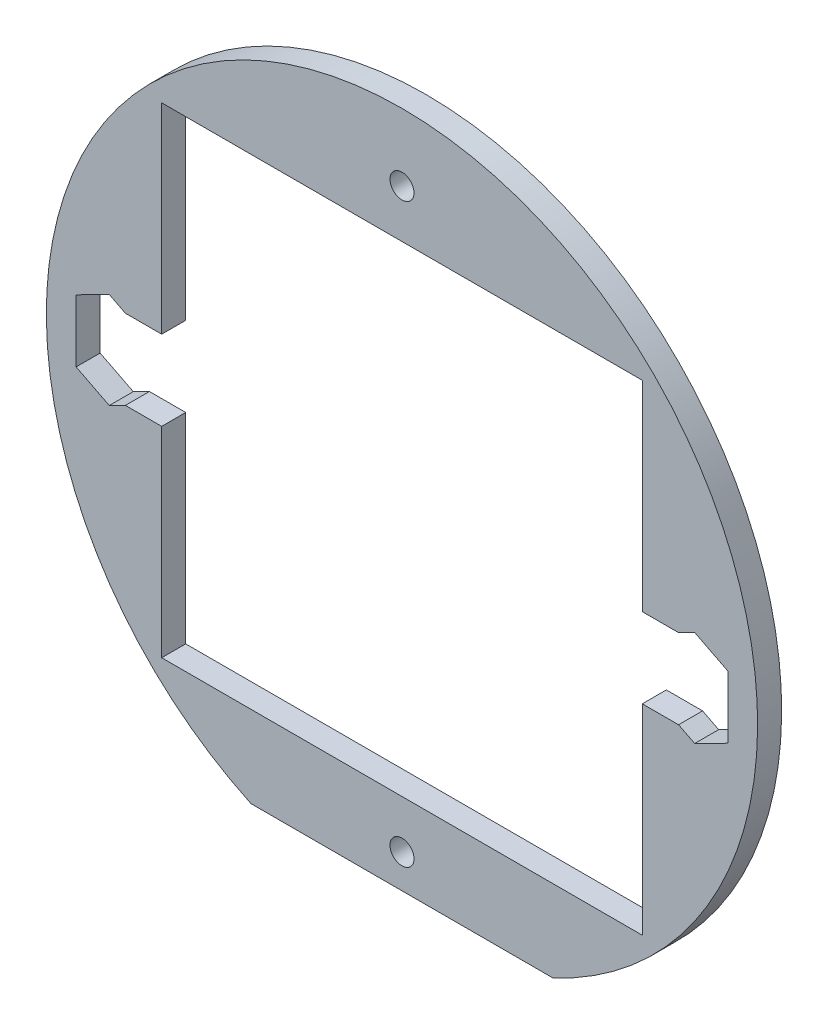
ISO-10303-21;
HEADER;
FILE_DESCRIPTION(('STEP AP214'),'2;1');
FILE_NAME('part.step','',(''),(''),'','','');
FILE_SCHEMA(('AUTOMOTIVE_DESIGN { 1 0 10303 214 1 1 1 1 }'));
ENDSEC;
DATA;
#1=APPLICATION_CONTEXT('core data for automotive mechanical design processes');
#2=APPLICATION_PROTOCOL_DEFINITION('international standard','automotive_design',2000,#1);
#3=PRODUCT_CONTEXT('',#1,'mechanical');
#4=PRODUCT('Part','Part','',(#3));
#5=PRODUCT_RELATED_PRODUCT_CATEGORY('part','',(#4));
#6=PRODUCT_DEFINITION_FORMATION('','',#4);
#7=PRODUCT_DEFINITION_CONTEXT('part definition',#1,'design');
#8=PRODUCT_DEFINITION('design','',#6,#7);
#9=PRODUCT_DEFINITION_SHAPE('','',#8);
#10=(LENGTH_UNIT() NAMED_UNIT(*) SI_UNIT(.MILLI.,.METRE.));
#11=(NAMED_UNIT(*) PLANE_ANGLE_UNIT() SI_UNIT($,.RADIAN.));
#12=(NAMED_UNIT(*) SI_UNIT($,.STERADIAN.) SOLID_ANGLE_UNIT());
#13=UNCERTAINTY_MEASURE_WITH_UNIT(LENGTH_MEASURE(1.E-05),#10,'distance_accuracy_value','');
#14=(GEOMETRIC_REPRESENTATION_CONTEXT(3) GLOBAL_UNCERTAINTY_ASSIGNED_CONTEXT((#13)) GLOBAL_UNIT_ASSIGNED_CONTEXT((#10,
#11,#12)) REPRESENTATION_CONTEXT('',''));
#15=CARTESIAN_POINT('',(0.,0.,0.));
#16=DIRECTION('',(0.,0.,1.));
#17=DIRECTION('',(1.,0.,0.));
#18=AXIS2_PLACEMENT_3D('',#15,#16,#17);
#19=CARTESIAN_POINT('',(-50.,50.,0.));
#20=DIRECTION('',(-1.,0.,0.));
#21=DIRECTION('',(0.,-1.,0.));
#22=AXIS2_PLACEMENT_3D('',#19,#20,#21);
#23=PLANE('',#22);
#24=DIRECTION('',(0.,-1.,0.));
#25=VECTOR('',#24,1.);
#26=CARTESIAN_POINT('',(-50.,50.,0.));
#27=LINE('',#26,#25);
#28=CARTESIAN_POINT('',(-50.,-8.3,0.));
#29=VERTEX_POINT('',#28);
#30=CARTESIAN_POINT('',(-50.,-50.,0.));
#31=VERTEX_POINT('',#30);
#32=EDGE_CURVE('E381',#29,#31,#27,.T.);
#33=ORIENTED_EDGE('',*,*,#32,.F.);
#34=DIRECTION('',(0.,0.,1.));
#35=VECTOR('',#34,1.);
#36=CARTESIAN_POINT('',(-50.,-8.3,0.));
#37=LINE('',#36,#35);
#38=CARTESIAN_POINT('',(-50.,-8.3,5.));
#39=VERTEX_POINT('',#38);
#40=EDGE_CURVE('E264',#29,#39,#37,.T.);
#41=ORIENTED_EDGE('',*,*,#40,.T.);
#42=DIRECTION('',(0.,-1.,0.));
#43=VECTOR('',#42,1.);
#44=CARTESIAN_POINT('',(-50.,50.,5.));
#45=LINE('',#44,#43);
#46=CARTESIAN_POINT('',(-50.,-50.,5.));
#47=VERTEX_POINT('',#46);
#48=EDGE_CURVE('E366',#39,#47,#45,.T.);
#49=ORIENTED_EDGE('',*,*,#48,.T.);
#50=DIRECTION('',(0.,0.,1.));
#51=VECTOR('',#50,1.);
#52=CARTESIAN_POINT('',(-50.,-50.,0.));
#53=LINE('',#52,#51);
#54=EDGE_CURVE('E393',#31,#47,#53,.T.);
#55=ORIENTED_EDGE('',*,*,#54,.F.);
#56=EDGE_LOOP('',(#33,#41,#49,#55));
#57=FACE_BOUND('',#56,.T.);
#58=ADVANCED_FACE('F43',(#57),#23,.F.);
#59=CARTESIAN_POINT('',(50.,50.,0.));
#60=DIRECTION('',(1.,0.,0.));
#61=DIRECTION('',(0.,1.,0.));
#62=AXIS2_PLACEMENT_3D('',#59,#60,#61);
#63=PLANE('',#62);
#64=DIRECTION('',(0.,1.,0.));
#65=VECTOR('',#64,1.);
#66=CARTESIAN_POINT('',(50.,50.,5.));
#67=LINE('',#66,#65);
#68=CARTESIAN_POINT('',(50.,-50.,5.));
#69=VERTEX_POINT('',#68);
#70=CARTESIAN_POINT('',(50.,-8.3,5.));
#71=VERTEX_POINT('',#70);
#72=EDGE_CURVE('E403',#69,#71,#67,.T.);
#73=ORIENTED_EDGE('',*,*,#72,.T.);
#74=DIRECTION('',(0.,0.,1.));
#75=VECTOR('',#74,1.);
#76=CARTESIAN_POINT('',(50.,-8.3,0.));
#77=LINE('',#76,#75);
#78=CARTESIAN_POINT('',(50.,-8.3,0.));
#79=VERTEX_POINT('',#78);
#80=EDGE_CURVE('E354',#79,#71,#77,.T.);
#81=ORIENTED_EDGE('',*,*,#80,.F.);
#82=DIRECTION('',(0.,1.,0.));
#83=VECTOR('',#82,1.);
#84=CARTESIAN_POINT('',(50.,50.,0.));
#85=LINE('',#84,#83);
#86=CARTESIAN_POINT('',(50.,-50.,0.));
#87=VERTEX_POINT('',#86);
#88=EDGE_CURVE('E386',#87,#79,#85,.T.);
#89=ORIENTED_EDGE('',*,*,#88,.F.);
#90=DIRECTION('',(0.,0.,1.));
#91=VECTOR('',#90,1.);
#92=CARTESIAN_POINT('',(50.,-50.,0.));
#93=LINE('',#92,#91);
#94=EDGE_CURVE('E419',#87,#69,#93,.T.);
#95=ORIENTED_EDGE('',*,*,#94,.T.);
#96=EDGE_LOOP('',(#73,#81,#89,#95));
#97=FACE_BOUND('',#96,.T.);
#98=ADVANCED_FACE('F462',(#97),#63,.F.);
#99=CARTESIAN_POINT('',(-31.41655614481,-67.,5.));
#100=DIRECTION('',(0.,1.,0.));
#101=DIRECTION('',(-1.,0.,0.));
#102=AXIS2_PLACEMENT_3D('',#99,#100,#101);
#103=PLANE('',#102);
#104=DIRECTION('',(1.,0.,0.));
#105=VECTOR('',#104,1.);
#106=CARTESIAN_POINT('',(-31.41655614481,-67.,0.));
#107=LINE('',#106,#105);
#108=CARTESIAN_POINT('',(-31.41655614481,-67.,0.));
#109=VERTEX_POINT('',#108);
#110=CARTESIAN_POINT('',(31.41655614481,-67.,0.));
#111=VERTEX_POINT('',#110);
#112=EDGE_CURVE('E414',#109,#111,#107,.T.);
#113=ORIENTED_EDGE('',*,*,#112,.T.);
#114=DIRECTION('',(0.,0.,-1.));
#115=VECTOR('',#114,1.);
#116=CARTESIAN_POINT('',(31.41655614481,-67.,5.));
#117=LINE('',#116,#115);
#118=CARTESIAN_POINT('',(31.41655614481,-67.,5.));
#119=VERTEX_POINT('',#118);
#120=EDGE_CURVE('E11',#119,#111,#117,.T.);
#121=ORIENTED_EDGE('',*,*,#120,.F.);
#122=DIRECTION('',(1.,0.,0.));
#123=VECTOR('',#122,1.);
#124=CARTESIAN_POINT('',(-31.41655614481,-67.,5.));
#125=LINE('',#124,#123);
#126=CARTESIAN_POINT('',(-31.41655614481,-67.,5.));
#127=VERTEX_POINT('',#126);
#128=EDGE_CURVE('E425',#127,#119,#125,.T.);
#129=ORIENTED_EDGE('',*,*,#128,.F.);
#130=DIRECTION('',(0.,0.,-1.));
#131=VECTOR('',#130,1.);
#132=CARTESIAN_POINT('',(-31.41655614481,-67.,5.));
#133=LINE('',#132,#131);
#134=EDGE_CURVE('E52',#127,#109,#133,.T.);
#135=ORIENTED_EDGE('',*,*,#134,.T.);
#136=EDGE_LOOP('',(#113,#121,#129,#135));
#137=FACE_BOUND('',#136,.T.);
#138=ADVANCED_FACE('F45',(#137),#103,.F.);
#139=CARTESIAN_POINT('',(0.,0.,5.));
#140=DIRECTION('',(0.,0.,-1.));
#141=DIRECTION('',(-1.,0.,0.));
#142=AXIS2_PLACEMENT_3D('',#139,#140,#141);
#143=CYLINDRICAL_SURFACE('',#142,74.);
#144=CARTESIAN_POINT('',(0.,0.,0.));
#145=DIRECTION('',(0.,0.,1.));
#146=DIRECTION('',(1.,0.,0.));
#147=AXIS2_PLACEMENT_3D('',#144,#145,#146);
#148=CIRCLE('',#147,74.);
#149=EDGE_CURVE('E430',#111,#109,#148,.T.);
#150=ORIENTED_EDGE('',*,*,#149,.T.);
#151=ORIENTED_EDGE('',*,*,#134,.F.);
#152=CARTESIAN_POINT('',(0.,0.,5.));
#153=DIRECTION('',(0.,0.,1.));
#154=DIRECTION('',(1.,0.,0.));
#155=AXIS2_PLACEMENT_3D('',#152,#153,#154);
#156=CIRCLE('',#155,74.);
#157=EDGE_CURVE('E429',#119,#127,#156,.T.);
#158=ORIENTED_EDGE('',*,*,#157,.F.);
#159=ORIENTED_EDGE('',*,*,#120,.T.);
#160=EDGE_LOOP('',(#150,#151,#158,#159));
#161=FACE_BOUND('',#160,.T.);
#162=ADVANCED_FACE('F445',(#161),#143,.T.);
#163=CARTESIAN_POINT('',(0.,0.,5.));
#164=DIRECTION('',(0.,0.,1.));
#165=DIRECTION('',(1.,0.,0.));
#166=AXIS2_PLACEMENT_3D('',#163,#164,#165);
#167=PLANE('',#166);
#168=DIRECTION('',(1.,0.,0.));
#169=VECTOR('',#168,1.);
#170=CARTESIAN_POINT('',(-50.,-8.3,5.));
#171=LINE('',#170,#169);
#172=CARTESIAN_POINT('',(-57.55,-8.3,5.));
#173=VERTEX_POINT('',#172);
#174=EDGE_CURVE('E220',#173,#39,#171,.T.);
#175=ORIENTED_EDGE('',*,*,#174,.F.);
#176=DIRECTION('',(0.891953238375036,0.452127659574469,0.));
#177=VECTOR('',#176,1.);
#178=CARTESIAN_POINT('',(-57.55,-8.3,5.));
#179=LINE('',#178,#177);
#180=CARTESIAN_POINT('',(-60.9037441762901,-10.,5.));
#181=VERTEX_POINT('',#180);
#182=EDGE_CURVE('E223',#181,#173,#179,.T.);
#183=ORIENTED_EDGE('',*,*,#182,.F.);
#184=DIRECTION('',(0.891918399697068,-0.452196382428941,0.));
#185=VECTOR('',#184,1.);
#186=CARTESIAN_POINT('',(-60.9037441762901,-10.,5.));
#187=LINE('',#186,#185);
#188=CARTESIAN_POINT('',(-67.8071925899454,-6.5,5.));
#189=VERTEX_POINT('',#188);
#190=EDGE_CURVE('E257',#189,#181,#187,.T.);
#191=ORIENTED_EDGE('',*,*,#190,.F.);
#192=DIRECTION('',(0.,-1.,0.));
#193=VECTOR('',#192,1.);
#194=CARTESIAN_POINT('',(-67.8071925899454,-6.5,5.));
#195=LINE('',#194,#193);
#196=CARTESIAN_POINT('',(-67.8071925899454,6.5,5.));
#197=VERTEX_POINT('',#196);
#198=EDGE_CURVE('E253',#197,#189,#195,.T.);
#199=ORIENTED_EDGE('',*,*,#198,.F.);
#200=DIRECTION('',(-0.891918399697068,-0.45219638242894,0.));
#201=VECTOR('',#200,1.);
#202=CARTESIAN_POINT('',(-67.8071925899454,6.5,5.));
#203=LINE('',#202,#201);
#204=CARTESIAN_POINT('',(-60.9037441762901,10.,5.));
#205=VERTEX_POINT('',#204);
#206=EDGE_CURVE('E249',#205,#197,#203,.T.);
#207=ORIENTED_EDGE('',*,*,#206,.F.);
#208=DIRECTION('',(-0.891953238375035,0.45212765957447,0.));
#209=VECTOR('',#208,1.);
#210=CARTESIAN_POINT('',(-60.9037441762901,10.,5.));
#211=LINE('',#210,#209);
#212=CARTESIAN_POINT('',(-57.55,8.3,5.));
#213=VERTEX_POINT('',#212);
#214=EDGE_CURVE('E245',#213,#205,#211,.T.);
#215=ORIENTED_EDGE('',*,*,#214,.F.);
#216=DIRECTION('',(-1.,0.,0.));
#217=VECTOR('',#216,1.);
#218=CARTESIAN_POINT('',(-57.55,8.3,5.));
#219=LINE('',#218,#217);
#220=CARTESIAN_POINT('',(-50.,8.3,5.));
#221=VERTEX_POINT('',#220);
#222=EDGE_CURVE('E195',#221,#213,#219,.T.);
#223=ORIENTED_EDGE('',*,*,#222,.F.);
#224=CARTESIAN_POINT('',(-50.,50.,5.));
#225=VERTEX_POINT('',#224);
#226=EDGE_CURVE('E394',#225,#221,#45,.T.);
#227=ORIENTED_EDGE('',*,*,#226,.F.);
#228=DIRECTION('',(-1.,0.,0.));
#229=VECTOR('',#228,1.);
#230=CARTESIAN_POINT('',(50.,50.,5.));
#231=LINE('',#230,#229);
#232=CARTESIAN_POINT('',(50.,50.,5.));
#233=VERTEX_POINT('',#232);
#234=EDGE_CURVE('E407',#233,#225,#231,.T.);
#235=ORIENTED_EDGE('',*,*,#234,.F.);
#236=CARTESIAN_POINT('',(50.,8.3,5.));
#237=VERTEX_POINT('',#236);
#238=EDGE_CURVE('E402',#237,#233,#67,.T.);
#239=ORIENTED_EDGE('',*,*,#238,.F.);
#240=DIRECTION('',(-1.,0.,0.));
#241=VECTOR('',#240,1.);
#242=CARTESIAN_POINT('',(57.55,8.3,5.));
#243=LINE('',#242,#241);
#244=CARTESIAN_POINT('',(57.55,8.3,5.));
#245=VERTEX_POINT('',#244);
#246=EDGE_CURVE('E67',#245,#237,#243,.T.);
#247=ORIENTED_EDGE('',*,*,#246,.F.);
#248=DIRECTION('',(-0.891953238375037,-0.452127659574467,0.));
#249=VECTOR('',#248,1.);
#250=CARTESIAN_POINT('',(60.9037441762901,9.99999999999999,5.));
#251=LINE('',#250,#249);
#252=CARTESIAN_POINT('',(60.9037441762901,9.99999999999999,5.));
#253=VERTEX_POINT('',#252);
#254=EDGE_CURVE('E315',#253,#245,#251,.T.);
#255=ORIENTED_EDGE('',*,*,#254,.F.);
#256=DIRECTION('',(-0.891918399697068,0.452196382428941,0.));
#257=VECTOR('',#256,1.);
#258=CARTESIAN_POINT('',(67.8071925899454,6.49999999999999,5.));
#259=LINE('',#258,#257);
#260=CARTESIAN_POINT('',(67.8071925899454,6.49999999999999,5.));
#261=VERTEX_POINT('',#260);
#262=EDGE_CURVE('E290',#261,#253,#259,.T.);
#263=ORIENTED_EDGE('',*,*,#262,.F.);
#264=DIRECTION('',(0.,1.,0.));
#265=VECTOR('',#264,1.);
#266=CARTESIAN_POINT('',(67.8071925899454,-6.5,5.));
#267=LINE('',#266,#265);
#268=CARTESIAN_POINT('',(67.8071925899454,-6.5,5.));
#269=VERTEX_POINT('',#268);
#270=EDGE_CURVE('E333',#269,#261,#267,.T.);
#271=ORIENTED_EDGE('',*,*,#270,.F.);
#272=DIRECTION('',(0.891918399697068,0.452196382428941,0.));
#273=VECTOR('',#272,1.);
#274=CARTESIAN_POINT('',(60.9037441762901,-10.,5.));
#275=LINE('',#274,#273);
#276=CARTESIAN_POINT('',(60.9037441762901,-10.,5.));
#277=VERTEX_POINT('',#276);
#278=EDGE_CURVE('E329',#277,#269,#275,.T.);
#279=ORIENTED_EDGE('',*,*,#278,.F.);
#280=DIRECTION('',(0.891953238375036,-0.452127659574469,0.));
#281=VECTOR('',#280,1.);
#282=CARTESIAN_POINT('',(57.55,-8.3,5.));
#283=LINE('',#282,#281);
#284=CARTESIAN_POINT('',(57.55,-8.3,5.));
#285=VERTEX_POINT('',#284);
#286=EDGE_CURVE('E325',#285,#277,#283,.T.);
#287=ORIENTED_EDGE('',*,*,#286,.F.);
#288=DIRECTION('',(1.,0.,0.));
#289=VECTOR('',#288,1.);
#290=CARTESIAN_POINT('',(50.,-8.3,5.));
#291=LINE('',#290,#289);
#292=EDGE_CURVE('E321',#71,#285,#291,.T.);
#293=ORIENTED_EDGE('',*,*,#292,.F.);
#294=ORIENTED_EDGE('',*,*,#72,.F.);
#295=DIRECTION('',(1.,0.,0.));
#296=VECTOR('',#295,1.);
#297=CARTESIAN_POINT('',(50.,-50.,5.));
#298=LINE('',#297,#296);
#299=EDGE_CURVE('E398',#47,#69,#298,.T.);
#300=ORIENTED_EDGE('',*,*,#299,.F.);
#301=ORIENTED_EDGE('',*,*,#48,.F.);
#302=EDGE_LOOP('',(#175,#183,#191,#199,#207,#215,#223,#227,#235,#239,#247,#255,#263,#271,#279,
#287,#293,#294,#300,#301));
#303=FACE_BOUND('',#302,.T.);
#304=CARTESIAN_POINT('',(0.,60.,5.));
#305=DIRECTION('',(0.,0.,1.));
#306=DIRECTION('',(1.,0.,0.));
#307=AXIS2_PLACEMENT_3D('',#304,#305,#306);
#308=CIRCLE('',#307,2.5);
#309=CARTESIAN_POINT('',(2.50000000000001,60.,5.));
#310=VERTEX_POINT('',#309);
#311=EDGE_CURVE('E367',#310,#310,#308,.T.);
#312=ORIENTED_EDGE('',*,*,#311,.F.);
#313=EDGE_LOOP('',(#312));
#314=FACE_BOUND('',#313,.T.);
#315=CARTESIAN_POINT('',(0.,-60.,5.));
#316=DIRECTION('',(0.,0.,1.));
#317=DIRECTION('',(1.,0.,0.));
#318=AXIS2_PLACEMENT_3D('',#315,#316,#317);
#319=CIRCLE('',#318,2.5);
#320=CARTESIAN_POINT('',(2.5,-60.,5.));
#321=VERTEX_POINT('',#320);
#322=EDGE_CURVE('E268',#321,#321,#319,.T.);
#323=ORIENTED_EDGE('',*,*,#322,.F.);
#324=EDGE_LOOP('',(#323));
#325=FACE_BOUND('',#324,.T.);
#326=ORIENTED_EDGE('',*,*,#128,.T.);
#327=ORIENTED_EDGE('',*,*,#157,.T.);
#328=EDGE_LOOP('',(#326,#327));
#329=FACE_BOUND('',#328,.T.);
#330=ADVANCED_FACE('F447',(#303,#314,#325,#329),#167,.T.);
#331=CARTESIAN_POINT('',(0.,0.,0.));
#332=DIRECTION('',(0.,0.,1.));
#333=DIRECTION('',(1.,0.,0.));
#334=AXIS2_PLACEMENT_3D('',#331,#332,#333);
#335=PLANE('',#334);
#336=CARTESIAN_POINT('',(0.,60.,0.));
#337=DIRECTION('',(0.,0.,1.));
#338=DIRECTION('',(1.,0.,0.));
#339=AXIS2_PLACEMENT_3D('',#336,#337,#338);
#340=CIRCLE('',#339,2.5);
#341=CARTESIAN_POINT('',(2.50000000000001,60.,0.));
#342=VERTEX_POINT('',#341);
#343=EDGE_CURVE('E362',#342,#342,#340,.T.);
#344=ORIENTED_EDGE('',*,*,#343,.T.);
#345=EDGE_LOOP('',(#344));
#346=FACE_BOUND('',#345,.T.);
#347=CARTESIAN_POINT('',(0.,-60.,0.));
#348=DIRECTION('',(0.,0.,1.));
#349=DIRECTION('',(1.,0.,0.));
#350=AXIS2_PLACEMENT_3D('',#347,#348,#349);
#351=CIRCLE('',#350,2.5);
#352=CARTESIAN_POINT('',(2.5,-60.,0.));
#353=VERTEX_POINT('',#352);
#354=EDGE_CURVE('E371',#353,#353,#351,.T.);
#355=ORIENTED_EDGE('',*,*,#354,.T.);
#356=EDGE_LOOP('',(#355));
#357=FACE_BOUND('',#356,.T.);
#358=DIRECTION('',(0.891953238375036,0.452127659574469,0.));
#359=VECTOR('',#358,1.);
#360=CARTESIAN_POINT('',(-57.55,-8.3,0.));
#361=LINE('',#360,#359);
#362=CARTESIAN_POINT('',(-60.9037441762901,-10.,0.));
#363=VERTEX_POINT('',#362);
#364=CARTESIAN_POINT('',(-57.55,-8.3,0.));
#365=VERTEX_POINT('',#364);
#366=EDGE_CURVE('E236',#363,#365,#361,.T.);
#367=ORIENTED_EDGE('',*,*,#366,.T.);
#368=DIRECTION('',(1.,0.,0.));
#369=VECTOR('',#368,1.);
#370=CARTESIAN_POINT('',(-50.,-8.3,0.));
#371=LINE('',#370,#369);
#372=EDGE_CURVE('E239',#365,#29,#371,.T.);
#373=ORIENTED_EDGE('',*,*,#372,.T.);
#374=ORIENTED_EDGE('',*,*,#32,.T.);
#375=DIRECTION('',(1.,0.,0.));
#376=VECTOR('',#375,1.);
#377=CARTESIAN_POINT('',(50.,-50.,0.));
#378=LINE('',#377,#376);
#379=EDGE_CURVE('E380',#31,#87,#378,.T.);
#380=ORIENTED_EDGE('',*,*,#379,.T.);
#381=ORIENTED_EDGE('',*,*,#88,.T.);
#382=DIRECTION('',(1.,0.,0.));
#383=VECTOR('',#382,1.);
#384=CARTESIAN_POINT('',(50.,-8.3,0.));
#385=LINE('',#384,#383);
#386=CARTESIAN_POINT('',(57.55,-8.3,0.));
#387=VERTEX_POINT('',#386);
#388=EDGE_CURVE('E294',#79,#387,#385,.T.);
#389=ORIENTED_EDGE('',*,*,#388,.T.);
#390=DIRECTION('',(0.891953238375036,-0.452127659574469,0.));
#391=VECTOR('',#390,1.);
#392=CARTESIAN_POINT('',(57.55,-8.3,0.));
#393=LINE('',#392,#391);
#394=CARTESIAN_POINT('',(60.9037441762901,-10.,0.));
#395=VERTEX_POINT('',#394);
#396=EDGE_CURVE('E298',#387,#395,#393,.T.);
#397=ORIENTED_EDGE('',*,*,#396,.T.);
#398=DIRECTION('',(0.891918399697068,0.452196382428941,0.));
#399=VECTOR('',#398,1.);
#400=CARTESIAN_POINT('',(60.9037441762901,-10.,0.));
#401=LINE('',#400,#399);
#402=CARTESIAN_POINT('',(67.8071925899454,-6.5,0.));
#403=VERTEX_POINT('',#402);
#404=EDGE_CURVE('E302',#395,#403,#401,.T.);
#405=ORIENTED_EDGE('',*,*,#404,.T.);
#406=DIRECTION('',(0.,1.,0.));
#407=VECTOR('',#406,1.);
#408=CARTESIAN_POINT('',(67.8071925899454,-6.5,0.));
#409=LINE('',#408,#407);
#410=CARTESIAN_POINT('',(67.8071925899454,6.49999999999999,0.));
#411=VERTEX_POINT('',#410);
#412=EDGE_CURVE('E306',#403,#411,#409,.T.);
#413=ORIENTED_EDGE('',*,*,#412,.T.);
#414=DIRECTION('',(-0.891918399697068,0.452196382428941,0.));
#415=VECTOR('',#414,1.);
#416=CARTESIAN_POINT('',(67.8071925899454,6.49999999999999,0.));
#417=LINE('',#416,#415);
#418=CARTESIAN_POINT('',(60.9037441762901,9.99999999999999,0.));
#419=VERTEX_POINT('',#418);
#420=EDGE_CURVE('E310',#411,#419,#417,.T.);
#421=ORIENTED_EDGE('',*,*,#420,.T.);
#422=DIRECTION('',(-0.891953238375037,-0.452127659574467,0.));
#423=VECTOR('',#422,1.);
#424=CARTESIAN_POINT('',(60.9037441762901,9.99999999999999,0.));
#425=LINE('',#424,#423);
#426=CARTESIAN_POINT('',(57.55,8.3,0.));
#427=VERTEX_POINT('',#426);
#428=EDGE_CURVE('E285',#419,#427,#425,.T.);
#429=ORIENTED_EDGE('',*,*,#428,.T.);
#430=DIRECTION('',(-1.,0.,0.));
#431=VECTOR('',#430,1.);
#432=CARTESIAN_POINT('',(57.55,8.3,0.));
#433=LINE('',#432,#431);
#434=CARTESIAN_POINT('',(50.,8.3,0.));
#435=VERTEX_POINT('',#434);
#436=EDGE_CURVE('E289',#427,#435,#433,.T.);
#437=ORIENTED_EDGE('',*,*,#436,.T.);
#438=CARTESIAN_POINT('',(50.,50.,0.));
#439=VERTEX_POINT('',#438);
#440=EDGE_CURVE('E385',#435,#439,#85,.T.);
#441=ORIENTED_EDGE('',*,*,#440,.T.);
#442=DIRECTION('',(-1.,0.,0.));
#443=VECTOR('',#442,1.);
#444=CARTESIAN_POINT('',(50.,50.,0.));
#445=LINE('',#444,#443);
#446=CARTESIAN_POINT('',(-50.,50.,0.));
#447=VERTEX_POINT('',#446);
#448=EDGE_CURVE('E390',#439,#447,#445,.T.);
#449=ORIENTED_EDGE('',*,*,#448,.T.);
#450=CARTESIAN_POINT('',(-50.,8.3,0.));
#451=VERTEX_POINT('',#450);
#452=EDGE_CURVE('E218',#447,#451,#27,.T.);
#453=ORIENTED_EDGE('',*,*,#452,.T.);
#454=DIRECTION('',(-1.,0.,0.));
#455=VECTOR('',#454,1.);
#456=CARTESIAN_POINT('',(-57.55,8.3,0.));
#457=LINE('',#456,#455);
#458=CARTESIAN_POINT('',(-57.55,8.3,0.));
#459=VERTEX_POINT('',#458);
#460=EDGE_CURVE('E59',#451,#459,#457,.T.);
#461=ORIENTED_EDGE('',*,*,#460,.T.);
#462=DIRECTION('',(-0.891953238375035,0.45212765957447,0.));
#463=VECTOR('',#462,1.);
#464=CARTESIAN_POINT('',(-60.9037441762901,10.,0.));
#465=LINE('',#464,#463);
#466=CARTESIAN_POINT('',(-60.9037441762901,10.,0.));
#467=VERTEX_POINT('',#466);
#468=EDGE_CURVE('E204',#459,#467,#465,.T.);
#469=ORIENTED_EDGE('',*,*,#468,.T.);
#470=DIRECTION('',(-0.891918399697068,-0.45219638242894,0.));
#471=VECTOR('',#470,1.);
#472=CARTESIAN_POINT('',(-67.8071925899454,6.5,0.));
#473=LINE('',#472,#471);
#474=CARTESIAN_POINT('',(-67.8071925899454,6.5,0.));
#475=VERTEX_POINT('',#474);
#476=EDGE_CURVE('E210',#467,#475,#473,.T.);
#477=ORIENTED_EDGE('',*,*,#476,.T.);
#478=DIRECTION('',(0.,-1.,0.));
#479=VECTOR('',#478,1.);
#480=CARTESIAN_POINT('',(-67.8071925899454,-6.5,0.));
#481=LINE('',#480,#479);
#482=CARTESIAN_POINT('',(-67.8071925899454,-6.5,0.));
#483=VERTEX_POINT('',#482);
#484=EDGE_CURVE('E228',#475,#483,#481,.T.);
#485=ORIENTED_EDGE('',*,*,#484,.T.);
#486=DIRECTION('',(0.891918399697068,-0.452196382428941,0.));
#487=VECTOR('',#486,1.);
#488=CARTESIAN_POINT('',(-60.9037441762901,-10.,0.));
#489=LINE('',#488,#487);
#490=EDGE_CURVE('E232',#483,#363,#489,.T.);
#491=ORIENTED_EDGE('',*,*,#490,.T.);
#492=EDGE_LOOP('',(#367,#373,#374,#380,#381,#389,#397,#405,#413,#421,#429,#437,#441,#449,#453,
#461,#469,#477,#485,#491));
#493=FACE_BOUND('',#492,.T.);
#494=ORIENTED_EDGE('',*,*,#112,.F.);
#495=ORIENTED_EDGE('',*,*,#149,.F.);
#496=EDGE_LOOP('',(#494,#495));
#497=FACE_BOUND('',#496,.T.);
#498=ADVANCED_FACE('F214',(#346,#357,#493,#497),#335,.F.);
#499=ORIENTED_EDGE('',*,*,#226,.T.);
#500=DIRECTION('',(0.,0.,1.));
#501=VECTOR('',#500,1.);
#502=CARTESIAN_POINT('',(-50.,8.3,0.));
#503=LINE('',#502,#501);
#504=EDGE_CURVE('E201',#451,#221,#503,.T.);
#505=ORIENTED_EDGE('',*,*,#504,.F.);
#506=ORIENTED_EDGE('',*,*,#452,.F.);
#507=DIRECTION('',(0.,0.,1.));
#508=VECTOR('',#507,1.);
#509=CARTESIAN_POINT('',(-50.,50.,0.));
#510=LINE('',#509,#508);
#511=EDGE_CURVE('E411',#447,#225,#510,.T.);
#512=ORIENTED_EDGE('',*,*,#511,.T.);
#513=EDGE_LOOP('',(#499,#505,#506,#512));
#514=FACE_BOUND('',#513,.T.);
#515=ADVANCED_FACE('F455',(#514),#23,.F.);
#516=CARTESIAN_POINT('',(50.,50.,0.));
#517=DIRECTION('',(0.,1.,0.));
#518=DIRECTION('',(-1.,0.,0.));
#519=AXIS2_PLACEMENT_3D('',#516,#517,#518);
#520=PLANE('',#519);
#521=ORIENTED_EDGE('',*,*,#234,.T.);
#522=ORIENTED_EDGE('',*,*,#511,.F.);
#523=ORIENTED_EDGE('',*,*,#448,.F.);
#524=DIRECTION('',(0.,0.,1.));
#525=VECTOR('',#524,1.);
#526=CARTESIAN_POINT('',(50.,50.,0.));
#527=LINE('',#526,#525);
#528=EDGE_CURVE('E415',#439,#233,#527,.T.);
#529=ORIENTED_EDGE('',*,*,#528,.T.);
#530=EDGE_LOOP('',(#521,#522,#523,#529));
#531=FACE_BOUND('',#530,.T.);
#532=ADVANCED_FACE('F473',(#531),#520,.F.);
#533=ORIENTED_EDGE('',*,*,#440,.F.);
#534=DIRECTION('',(0.,0.,1.));
#535=VECTOR('',#534,1.);
#536=CARTESIAN_POINT('',(50.,8.3,0.));
#537=LINE('',#536,#535);
#538=EDGE_CURVE('E357',#435,#237,#537,.T.);
#539=ORIENTED_EDGE('',*,*,#538,.T.);
#540=ORIENTED_EDGE('',*,*,#238,.T.);
#541=ORIENTED_EDGE('',*,*,#528,.F.);
#542=EDGE_LOOP('',(#533,#539,#540,#541));
#543=FACE_BOUND('',#542,.T.);
#544=ADVANCED_FACE('F469',(#543),#63,.F.);
#545=CARTESIAN_POINT('',(50.,-50.,0.));
#546=DIRECTION('',(0.,-1.,0.));
#547=DIRECTION('',(1.,0.,0.));
#548=AXIS2_PLACEMENT_3D('',#545,#546,#547);
#549=PLANE('',#548);
#550=ORIENTED_EDGE('',*,*,#299,.T.);
#551=ORIENTED_EDGE('',*,*,#94,.F.);
#552=ORIENTED_EDGE('',*,*,#379,.F.);
#553=ORIENTED_EDGE('',*,*,#54,.T.);
#554=EDGE_LOOP('',(#550,#551,#552,#553));
#555=FACE_BOUND('',#554,.T.);
#556=ADVANCED_FACE('F508',(#555),#549,.F.);
#557=CARTESIAN_POINT('',(0.,-60.,0.));
#558=DIRECTION('',(0.,0.,1.));
#559=DIRECTION('',(1.,0.,0.));
#560=AXIS2_PLACEMENT_3D('',#557,#558,#559);
#561=CYLINDRICAL_SURFACE('',#560,2.5);
#562=ORIENTED_EDGE('',*,*,#354,.F.);
#563=EDGE_LOOP('',(#562));
#564=FACE_BOUND('',#563,.T.);
#565=ORIENTED_EDGE('',*,*,#322,.T.);
#566=EDGE_LOOP('',(#565));
#567=FACE_BOUND('',#566,.T.);
#568=ADVANCED_FACE('F558',(#564,#567),#561,.F.);
#569=CARTESIAN_POINT('',(0.,60.,0.));
#570=DIRECTION('',(0.,0.,1.));
#571=DIRECTION('',(1.,0.,0.));
#572=AXIS2_PLACEMENT_3D('',#569,#570,#571);
#573=CYLINDRICAL_SURFACE('',#572,2.5);
#574=ORIENTED_EDGE('',*,*,#343,.F.);
#575=EDGE_LOOP('',(#574));
#576=FACE_BOUND('',#575,.T.);
#577=ORIENTED_EDGE('',*,*,#311,.T.);
#578=EDGE_LOOP('',(#577));
#579=FACE_BOUND('',#578,.T.);
#580=ADVANCED_FACE('F555',(#576,#579),#573,.F.);
#581=CARTESIAN_POINT('',(60.9037441762901,9.99999999999999,0.));
#582=DIRECTION('',(-0.452127659574467,0.891953238375037,0.));
#583=DIRECTION('',(-0.891953238375037,-0.452127659574467,0.));
#584=AXIS2_PLACEMENT_3D('',#581,#582,#583);
#585=PLANE('',#584);
#586=ORIENTED_EDGE('',*,*,#254,.T.);
#587=DIRECTION('',(0.,0.,1.));
#588=VECTOR('',#587,1.);
#589=CARTESIAN_POINT('',(57.55,8.3,0.));
#590=LINE('',#589,#588);
#591=EDGE_CURVE('E314',#427,#245,#590,.T.);
#592=ORIENTED_EDGE('',*,*,#591,.F.);
#593=ORIENTED_EDGE('',*,*,#428,.F.);
#594=DIRECTION('',(0.,0.,1.));
#595=VECTOR('',#594,1.);
#596=CARTESIAN_POINT('',(60.9037441762901,9.99999999999999,0.));
#597=LINE('',#596,#595);
#598=EDGE_CURVE('E246',#419,#253,#597,.T.);
#599=ORIENTED_EDGE('',*,*,#598,.T.);
#600=EDGE_LOOP('',(#586,#592,#593,#599));
#601=FACE_BOUND('',#600,.T.);
#602=ADVANCED_FACE('F534',(#601),#585,.F.);
#603=CARTESIAN_POINT('',(67.8071925899454,6.49999999999999,0.));
#604=DIRECTION('',(0.452196382428941,0.891918399697068,0.));
#605=DIRECTION('',(-0.891918399697068,0.452196382428941,0.));
#606=AXIS2_PLACEMENT_3D('',#603,#604,#605);
#607=PLANE('',#606);
#608=ORIENTED_EDGE('',*,*,#262,.T.);
#609=ORIENTED_EDGE('',*,*,#598,.F.);
#610=ORIENTED_EDGE('',*,*,#420,.F.);
#611=DIRECTION('',(0.,0.,1.));
#612=VECTOR('',#611,1.);
#613=CARTESIAN_POINT('',(67.8071925899454,6.49999999999999,0.));
#614=LINE('',#613,#612);
#615=EDGE_CURVE('E342',#411,#261,#614,.T.);
#616=ORIENTED_EDGE('',*,*,#615,.T.);
#617=EDGE_LOOP('',(#608,#609,#610,#616));
#618=FACE_BOUND('',#617,.T.);
#619=ADVANCED_FACE('F530',(#618),#607,.F.);
#620=CARTESIAN_POINT('',(67.8071925899454,-6.5,0.));
#621=DIRECTION('',(1.,0.,0.));
#622=DIRECTION('',(0.,0.,-1.));
#623=AXIS2_PLACEMENT_3D('',#620,#621,#622);
#624=PLANE('',#623);
#625=ORIENTED_EDGE('',*,*,#270,.T.);
#626=ORIENTED_EDGE('',*,*,#615,.F.);
#627=ORIENTED_EDGE('',*,*,#412,.F.);
#628=DIRECTION('',(0.,0.,1.));
#629=VECTOR('',#628,1.);
#630=CARTESIAN_POINT('',(67.8071925899454,-6.5,0.));
#631=LINE('',#630,#629);
#632=EDGE_CURVE('E345',#403,#269,#631,.T.);
#633=ORIENTED_EDGE('',*,*,#632,.T.);
#634=EDGE_LOOP('',(#625,#626,#627,#633));
#635=FACE_BOUND('',#634,.T.);
#636=ADVANCED_FACE('F526',(#635),#624,.F.);
#637=CARTESIAN_POINT('',(60.9037441762901,-10.,0.));
#638=DIRECTION('',(0.452196382428941,-0.891918399697068,0.));
#639=DIRECTION('',(0.891918399697068,0.452196382428941,0.));
#640=AXIS2_PLACEMENT_3D('',#637,#638,#639);
#641=PLANE('',#640);
#642=ORIENTED_EDGE('',*,*,#278,.T.);
#643=ORIENTED_EDGE('',*,*,#632,.F.);
#644=ORIENTED_EDGE('',*,*,#404,.F.);
#645=DIRECTION('',(0.,0.,1.));
#646=VECTOR('',#645,1.);
#647=CARTESIAN_POINT('',(60.9037441762901,-10.,0.));
#648=LINE('',#647,#646);
#649=EDGE_CURVE('E348',#395,#277,#648,.T.);
#650=ORIENTED_EDGE('',*,*,#649,.T.);
#651=EDGE_LOOP('',(#642,#643,#644,#650));
#652=FACE_BOUND('',#651,.T.);
#653=ADVANCED_FACE('F522',(#652),#641,.F.);
#654=CARTESIAN_POINT('',(57.55,-8.3,0.));
#655=DIRECTION('',(-0.452127659574469,-0.891953238375036,0.));
#656=DIRECTION('',(0.891953238375036,-0.452127659574469,0.));
#657=AXIS2_PLACEMENT_3D('',#654,#655,#656);
#658=PLANE('',#657);
#659=ORIENTED_EDGE('',*,*,#286,.T.);
#660=ORIENTED_EDGE('',*,*,#649,.F.);
#661=ORIENTED_EDGE('',*,*,#396,.F.);
#662=DIRECTION('',(0.,0.,1.));
#663=VECTOR('',#662,1.);
#664=CARTESIAN_POINT('',(57.55,-8.3,0.));
#665=LINE('',#664,#663);
#666=EDGE_CURVE('E351',#387,#285,#665,.T.);
#667=ORIENTED_EDGE('',*,*,#666,.T.);
#668=EDGE_LOOP('',(#659,#660,#661,#667));
#669=FACE_BOUND('',#668,.T.);
#670=ADVANCED_FACE('F518',(#669),#658,.F.);
#671=CARTESIAN_POINT('',(50.,-8.3,0.));
#672=DIRECTION('',(0.,-1.,0.));
#673=DIRECTION('',(0.,0.,-1.));
#674=AXIS2_PLACEMENT_3D('',#671,#672,#673);
#675=PLANE('',#674);
#676=ORIENTED_EDGE('',*,*,#292,.T.);
#677=ORIENTED_EDGE('',*,*,#666,.F.);
#678=ORIENTED_EDGE('',*,*,#388,.F.);
#679=ORIENTED_EDGE('',*,*,#80,.T.);
#680=EDGE_LOOP('',(#676,#677,#678,#679));
#681=FACE_BOUND('',#680,.T.);
#682=ADVANCED_FACE('F516',(#681),#675,.F.);
#683=CARTESIAN_POINT('',(57.55,8.3,0.));
#684=DIRECTION('',(0.,1.,0.));
#685=DIRECTION('',(0.,0.,1.));
#686=AXIS2_PLACEMENT_3D('',#683,#684,#685);
#687=PLANE('',#686);
#688=ORIENTED_EDGE('',*,*,#246,.T.);
#689=ORIENTED_EDGE('',*,*,#538,.F.);
#690=ORIENTED_EDGE('',*,*,#436,.F.);
#691=ORIENTED_EDGE('',*,*,#591,.T.);
#692=EDGE_LOOP('',(#688,#689,#690,#691));
#693=FACE_BOUND('',#692,.T.);
#694=ADVANCED_FACE('F541',(#693),#687,.F.);
#695=CARTESIAN_POINT('',(-50.,-8.3,0.));
#696=DIRECTION('',(0.,-1.,0.));
#697=DIRECTION('',(0.,0.,-1.));
#698=AXIS2_PLACEMENT_3D('',#695,#696,#697);
#699=PLANE('',#698);
#700=ORIENTED_EDGE('',*,*,#174,.T.);
#701=ORIENTED_EDGE('',*,*,#40,.F.);
#702=ORIENTED_EDGE('',*,*,#372,.F.);
#703=DIRECTION('',(0.,0.,1.));
#704=VECTOR('',#703,1.);
#705=CARTESIAN_POINT('',(-57.55,-8.3,0.));
#706=LINE('',#705,#704);
#707=EDGE_CURVE('E269',#365,#173,#706,.T.);
#708=ORIENTED_EDGE('',*,*,#707,.T.);
#709=EDGE_LOOP('',(#700,#701,#702,#708));
#710=FACE_BOUND('',#709,.T.);
#711=ADVANCED_FACE('F543',(#710),#699,.F.);
#712=CARTESIAN_POINT('',(-57.55,-8.3,0.));
#713=DIRECTION('',(0.452127659574469,-0.891953238375036,0.));
#714=DIRECTION('',(0.891953238375036,0.452127659574469,0.));
#715=AXIS2_PLACEMENT_3D('',#712,#713,#714);
#716=PLANE('',#715);
#717=ORIENTED_EDGE('',*,*,#182,.T.);
#718=ORIENTED_EDGE('',*,*,#707,.F.);
#719=ORIENTED_EDGE('',*,*,#366,.F.);
#720=DIRECTION('',(0.,0.,1.));
#721=VECTOR('',#720,1.);
#722=CARTESIAN_POINT('',(-60.9037441762901,-10.,0.));
#723=LINE('',#722,#721);
#724=EDGE_CURVE('E272',#363,#181,#723,.T.);
#725=ORIENTED_EDGE('',*,*,#724,.T.);
#726=EDGE_LOOP('',(#717,#718,#719,#725));
#727=FACE_BOUND('',#726,.T.);
#728=ADVANCED_FACE('F497',(#727),#716,.F.);
#729=CARTESIAN_POINT('',(-60.9037441762901,-10.,0.));
#730=DIRECTION('',(-0.452196382428941,-0.891918399697068,0.));
#731=DIRECTION('',(0.891918399697068,-0.452196382428941,0.));
#732=AXIS2_PLACEMENT_3D('',#729,#730,#731);
#733=PLANE('',#732);
#734=ORIENTED_EDGE('',*,*,#190,.T.);
#735=ORIENTED_EDGE('',*,*,#724,.F.);
#736=ORIENTED_EDGE('',*,*,#490,.F.);
#737=DIRECTION('',(0.,0.,1.));
#738=VECTOR('',#737,1.);
#739=CARTESIAN_POINT('',(-67.8071925899454,-6.5,0.));
#740=LINE('',#739,#738);
#741=EDGE_CURVE('E275',#483,#189,#740,.T.);
#742=ORIENTED_EDGE('',*,*,#741,.T.);
#743=EDGE_LOOP('',(#734,#735,#736,#742));
#744=FACE_BOUND('',#743,.T.);
#745=ADVANCED_FACE('F493',(#744),#733,.F.);
#746=CARTESIAN_POINT('',(-67.8071925899454,-6.5,0.));
#747=DIRECTION('',(-1.,0.,0.));
#748=DIRECTION('',(0.,0.,1.));
#749=AXIS2_PLACEMENT_3D('',#746,#747,#748);
#750=PLANE('',#749);
#751=ORIENTED_EDGE('',*,*,#198,.T.);
#752=ORIENTED_EDGE('',*,*,#741,.F.);
#753=ORIENTED_EDGE('',*,*,#484,.F.);
#754=DIRECTION('',(0.,0.,1.));
#755=VECTOR('',#754,1.);
#756=CARTESIAN_POINT('',(-67.8071925899454,6.5,0.));
#757=LINE('',#756,#755);
#758=EDGE_CURVE('E278',#475,#197,#757,.T.);
#759=ORIENTED_EDGE('',*,*,#758,.T.);
#760=EDGE_LOOP('',(#751,#752,#753,#759));
#761=FACE_BOUND('',#760,.T.);
#762=ADVANCED_FACE('F491',(#761),#750,.F.);
#763=CARTESIAN_POINT('',(-67.8071925899454,6.5,0.));
#764=DIRECTION('',(-0.45219638242894,0.891918399697068,0.));
#765=DIRECTION('',(-0.891918399697069,-0.45219638242894,0.));
#766=AXIS2_PLACEMENT_3D('',#763,#764,#765);
#767=PLANE('',#766);
#768=ORIENTED_EDGE('',*,*,#206,.T.);
#769=ORIENTED_EDGE('',*,*,#758,.F.);
#770=ORIENTED_EDGE('',*,*,#476,.F.);
#771=DIRECTION('',(0.,0.,1.));
#772=VECTOR('',#771,1.);
#773=CARTESIAN_POINT('',(-60.9037441762901,10.,0.));
#774=LINE('',#773,#772);
#775=EDGE_CURVE('E200',#467,#205,#774,.T.);
#776=ORIENTED_EDGE('',*,*,#775,.T.);
#777=EDGE_LOOP('',(#768,#769,#770,#776));
#778=FACE_BOUND('',#777,.T.);
#779=ADVANCED_FACE('F487',(#778),#767,.F.);
#780=CARTESIAN_POINT('',(-60.9037441762901,10.,0.));
#781=DIRECTION('',(0.45212765957447,0.891953238375035,0.));
#782=DIRECTION('',(-0.891953238375035,0.45212765957447,0.));
#783=AXIS2_PLACEMENT_3D('',#780,#781,#782);
#784=PLANE('',#783);
#785=ORIENTED_EDGE('',*,*,#214,.T.);
#786=ORIENTED_EDGE('',*,*,#775,.F.);
#787=ORIENTED_EDGE('',*,*,#468,.F.);
#788=DIRECTION('',(0.,0.,1.));
#789=VECTOR('',#788,1.);
#790=CARTESIAN_POINT('',(-57.55,8.3,0.));
#791=LINE('',#790,#789);
#792=EDGE_CURVE('E191',#459,#213,#791,.T.);
#793=ORIENTED_EDGE('',*,*,#792,.T.);
#794=EDGE_LOOP('',(#785,#786,#787,#793));
#795=FACE_BOUND('',#794,.T.);
#796=ADVANCED_FACE('F205',(#795),#784,.F.);
#797=CARTESIAN_POINT('',(-57.55,8.3,0.));
#798=DIRECTION('',(0.,1.,0.));
#799=DIRECTION('',(0.,0.,1.));
#800=AXIS2_PLACEMENT_3D('',#797,#798,#799);
#801=PLANE('',#800);
#802=ORIENTED_EDGE('',*,*,#222,.T.);
#803=ORIENTED_EDGE('',*,*,#792,.F.);
#804=ORIENTED_EDGE('',*,*,#460,.F.);
#805=ORIENTED_EDGE('',*,*,#504,.T.);
#806=EDGE_LOOP('',(#802,#803,#804,#805));
#807=FACE_BOUND('',#806,.T.);
#808=ADVANCED_FACE('F193',(#807),#801,.F.);
#809=CLOSED_SHELL('',(#58,#98,#138,#162,#330,#498,#515,#532,#544,#556,#568,#580,#602,#619,#636,
#653,#670,#682,#694,#711,#728,#745,#762,#779,#796,#808));
#810=MANIFOLD_SOLID_BREP('B2',#809);
#811=ADVANCED_BREP_SHAPE_REPRESENTATION('',(#18,#810),#14);
#812=SHAPE_DEFINITION_REPRESENTATION(#9,#811);
ENDSEC;
END-ISO-10303-21;
